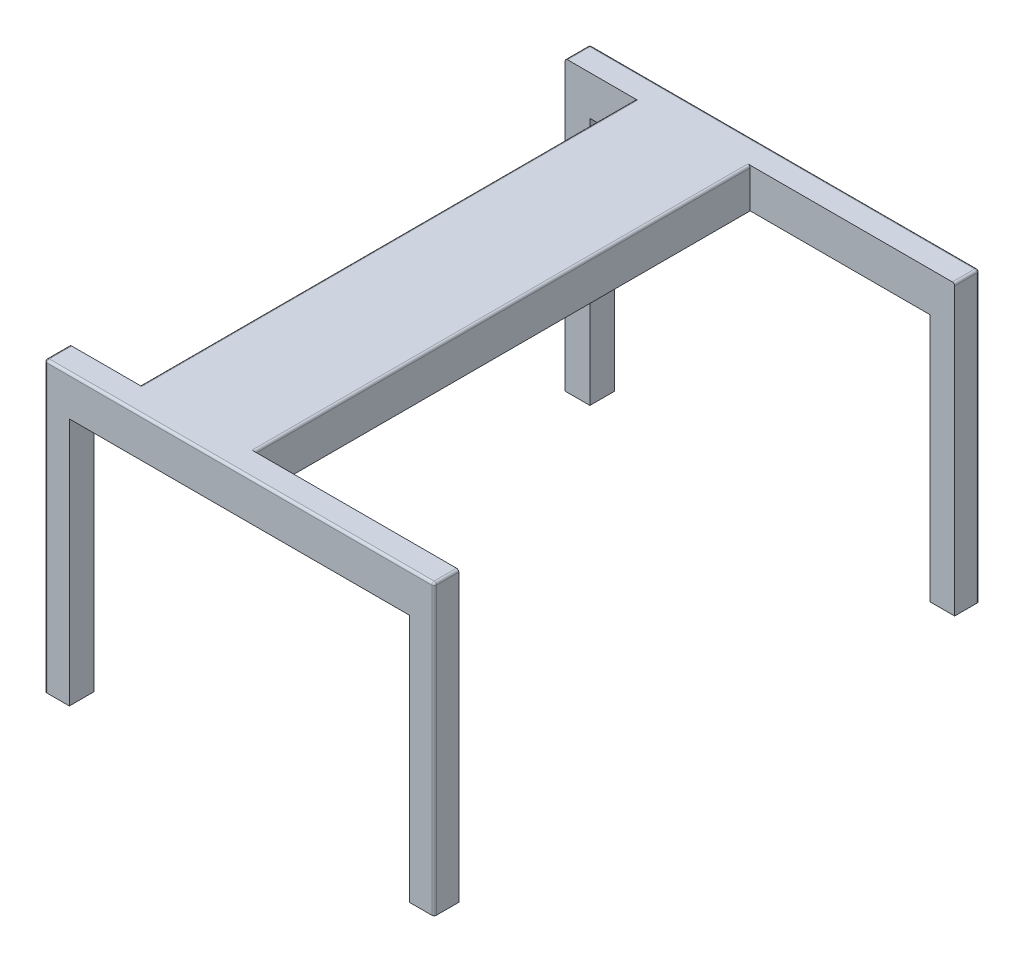
ISO-10303-21;
HEADER;
FILE_DESCRIPTION(('STEP AP214'),'2;1');
FILE_NAME('part.step','',(''),(''),'','','');
FILE_SCHEMA(('AUTOMOTIVE_DESIGN { 1 0 10303 214 1 1 1 1 }'));
ENDSEC;
DATA;
#1=APPLICATION_CONTEXT('core data for automotive mechanical design processes');
#2=APPLICATION_PROTOCOL_DEFINITION('international standard','automotive_design',2000,#1);
#3=PRODUCT_CONTEXT('',#1,'mechanical');
#4=PRODUCT('Part','Part','',(#3));
#5=PRODUCT_RELATED_PRODUCT_CATEGORY('part','',(#4));
#6=PRODUCT_DEFINITION_FORMATION('','',#4);
#7=PRODUCT_DEFINITION_CONTEXT('part definition',#1,'design');
#8=PRODUCT_DEFINITION('design','',#6,#7);
#9=PRODUCT_DEFINITION_SHAPE('','',#8);
#10=(LENGTH_UNIT() NAMED_UNIT(*) SI_UNIT(.MILLI.,.METRE.));
#11=(NAMED_UNIT(*) PLANE_ANGLE_UNIT() SI_UNIT($,.RADIAN.));
#12=(NAMED_UNIT(*) SI_UNIT($,.STERADIAN.) SOLID_ANGLE_UNIT());
#13=UNCERTAINTY_MEASURE_WITH_UNIT(LENGTH_MEASURE(1.E-05),#10,'distance_accuracy_value','');
#14=(GEOMETRIC_REPRESENTATION_CONTEXT(3) GLOBAL_UNCERTAINTY_ASSIGNED_CONTEXT((#13)) GLOBAL_UNIT_ASSIGNED_CONTEXT((#10,
#11,#12)) REPRESENTATION_CONTEXT('',''));
#15=CARTESIAN_POINT('',(0.,0.,0.));
#16=DIRECTION('',(0.,0.,1.));
#17=DIRECTION('',(1.,0.,0.));
#18=AXIS2_PLACEMENT_3D('',#15,#16,#17);
#19=CARTESIAN_POINT('',(1000.,0.,1400.));
#20=DIRECTION('',(-1.,0.,0.));
#21=DIRECTION('',(0.,0.,1.));
#22=AXIS2_PLACEMENT_3D('',#19,#20,#21);
#23=PLANE('',#22);
#24=DIRECTION('',(0.,0.,-1.));
#25=VECTOR('',#24,1.);
#26=CARTESIAN_POINT('',(1000.,-6.,1400.));
#27=LINE('',#26,#25);
#28=CARTESIAN_POINT('',(1000.,-6.00000000000001,1336.5));
#29=VERTEX_POINT('',#28);
#30=CARTESIAN_POINT('',(1000.,-6.,1394.));
#31=VERTEX_POINT('',#30);
#32=EDGE_CURVE('E326',#29,#31,#27,.F.);
#33=ORIENTED_EDGE('',*,*,#32,.T.);
#34=DIRECTION('',(0.,1.,0.));
#35=VECTOR('',#34,1.);
#36=CARTESIAN_POINT('',(1000.,-740.,1394.));
#37=LINE('',#36,#35);
#38=CARTESIAN_POINT('',(1000.,-740.,1394.));
#39=VERTEX_POINT('',#38);
#40=EDGE_CURVE('E377',#31,#39,#37,.F.);
#41=ORIENTED_EDGE('',*,*,#40,.T.);
#42=DIRECTION('',(0.,0.,-1.));
#43=VECTOR('',#42,1.);
#44=CARTESIAN_POINT('',(1000.,-740.,1400.));
#45=LINE('',#44,#43);
#46=CARTESIAN_POINT('',(1000.,-740.,1336.5));
#47=VERTEX_POINT('',#46);
#48=EDGE_CURVE('E285',#39,#47,#45,.T.);
#49=ORIENTED_EDGE('',*,*,#48,.T.);
#50=DIRECTION('',(0.,-1.,0.));
#51=VECTOR('',#50,1.);
#52=CARTESIAN_POINT('',(1000.,-101.6,1336.5));
#53=LINE('',#52,#51);
#54=EDGE_CURVE('E563',#29,#47,#53,.T.);
#55=ORIENTED_EDGE('',*,*,#54,.F.);
#56=EDGE_LOOP('',(#33,#41,#49,#55));
#57=FACE_BOUND('',#56,.T.);
#58=ADVANCED_FACE('F36',(#57),#23,.F.);
#59=CARTESIAN_POINT('',(0.,0.,1400.));
#60=DIRECTION('',(1.,0.,0.));
#61=DIRECTION('',(0.,1.,0.));
#62=AXIS2_PLACEMENT_3D('',#59,#60,#61);
#63=PLANE('',#62);
#64=DIRECTION('',(0.,0.,-1.));
#65=VECTOR('',#64,1.);
#66=CARTESIAN_POINT('',(0.,-6.,1400.));
#67=LINE('',#66,#65);
#68=CARTESIAN_POINT('',(0.,-6.00000000000001,63.5));
#69=VERTEX_POINT('',#68);
#70=CARTESIAN_POINT('',(0.,-6.,6.00000000000001));
#71=VERTEX_POINT('',#70);
#72=EDGE_CURVE('E315',#69,#71,#67,.T.);
#73=ORIENTED_EDGE('',*,*,#72,.T.);
#74=DIRECTION('',(0.,-1.,0.));
#75=VECTOR('',#74,1.);
#76=CARTESIAN_POINT('',(0.,0.,6.00000000000001));
#77=LINE('',#76,#75);
#78=CARTESIAN_POINT('',(0.,-740.,6.00000000000001));
#79=VERTEX_POINT('',#78);
#80=EDGE_CURVE('E364',#71,#79,#77,.T.);
#81=ORIENTED_EDGE('',*,*,#80,.T.);
#82=DIRECTION('',(0.,0.,-1.));
#83=VECTOR('',#82,1.);
#84=CARTESIAN_POINT('',(0.,-740.,1400.));
#85=LINE('',#84,#83);
#86=CARTESIAN_POINT('',(2.22044604925031E-13,-740.,63.4999999999999));
#87=VERTEX_POINT('',#86);
#88=EDGE_CURVE('E287',#87,#79,#85,.T.);
#89=ORIENTED_EDGE('',*,*,#88,.F.);
#90=DIRECTION('',(0.,1.,0.));
#91=VECTOR('',#90,1.);
#92=CARTESIAN_POINT('',(0.,-101.6,63.5));
#93=LINE('',#92,#91);
#94=EDGE_CURVE('E536',#87,#69,#93,.T.);
#95=ORIENTED_EDGE('',*,*,#94,.T.);
#96=EDGE_LOOP('',(#73,#81,#89,#95));
#97=FACE_BOUND('',#96,.T.);
#98=ADVANCED_FACE('F475',(#97),#63,.F.);
#99=CARTESIAN_POINT('',(0.,-740.,1400.));
#100=DIRECTION('',(0.,1.,0.));
#101=DIRECTION('',(0.,0.,1.));
#102=AXIS2_PLACEMENT_3D('',#99,#100,#101);
#103=PLANE('',#102);
#104=DIRECTION('',(1.,0.,0.));
#105=VECTOR('',#104,1.);
#106=CARTESIAN_POINT('',(0.,-740.,1400.));
#107=LINE('',#106,#105);
#108=CARTESIAN_POINT('',(6.00000000000009,-740.,1400.));
#109=VERTEX_POINT('',#108);
#110=CARTESIAN_POINT('',(63.5,-740.,1400.));
#111=VERTEX_POINT('',#110);
#112=EDGE_CURVE('E278',#109,#111,#107,.T.);
#113=ORIENTED_EDGE('',*,*,#112,.F.);
#114=CARTESIAN_POINT('',(6.00000000000009,-740.,1394.));
#115=DIRECTION('',(0.,1.,0.));
#116=DIRECTION('',(0.,0.,1.));
#117=AXIS2_PLACEMENT_3D('',#114,#115,#116);
#118=CIRCLE('',#117,6.);
#119=CARTESIAN_POINT('',(0.,-740.,1394.));
#120=VERTEX_POINT('',#119);
#121=EDGE_CURVE('E383',#109,#120,#118,.F.);
#122=ORIENTED_EDGE('',*,*,#121,.T.);
#123=CARTESIAN_POINT('',(2.22044604925031E-13,-740.,1336.5));
#124=VERTEX_POINT('',#123);
#125=EDGE_CURVE('E246',#120,#124,#85,.T.);
#126=ORIENTED_EDGE('',*,*,#125,.T.);
#127=DIRECTION('',(1.,0.,0.));
#128=VECTOR('',#127,1.);
#129=CARTESIAN_POINT('',(2.22044604925031E-13,-740.,1336.5));
#130=LINE('',#129,#128);
#131=CARTESIAN_POINT('',(63.5,-740.,1336.5));
#132=VERTEX_POINT('',#131);
#133=EDGE_CURVE('E429',#124,#132,#130,.T.);
#134=ORIENTED_EDGE('',*,*,#133,.T.);
#135=DIRECTION('',(0.,0.,1.));
#136=VECTOR('',#135,1.);
#137=CARTESIAN_POINT('',(63.5,-740.,-1081.51909830571));
#138=LINE('',#137,#136);
#139=EDGE_CURVE('E277',#132,#111,#138,.T.);
#140=ORIENTED_EDGE('',*,*,#139,.T.);
#141=EDGE_LOOP('',(#113,#122,#126,#134,#140));
#142=FACE_BOUND('',#141,.T.);
#143=ADVANCED_FACE('F424',(#142),#103,.F.);
#144=ORIENTED_EDGE('',*,*,#48,.F.);
#145=CARTESIAN_POINT('',(994.,-740.,1394.));
#146=DIRECTION('',(0.,1.,0.));
#147=DIRECTION('',(0.,0.,1.));
#148=AXIS2_PLACEMENT_3D('',#145,#146,#147);
#149=CIRCLE('',#148,6.);
#150=CARTESIAN_POINT('',(994.,-740.,1400.));
#151=VERTEX_POINT('',#150);
#152=EDGE_CURVE('E379',#39,#151,#149,.F.);
#153=ORIENTED_EDGE('',*,*,#152,.T.);
#154=CARTESIAN_POINT('',(936.5,-740.,1400.));
#155=VERTEX_POINT('',#154);
#156=EDGE_CURVE('E281',#155,#151,#107,.T.);
#157=ORIENTED_EDGE('',*,*,#156,.F.);
#158=DIRECTION('',(0.,0.,1.));
#159=VECTOR('',#158,1.);
#160=CARTESIAN_POINT('',(936.5,-740.,-1081.51909830571));
#161=LINE('',#160,#159);
#162=CARTESIAN_POINT('',(936.5,-740.,1336.5));
#163=VERTEX_POINT('',#162);
#164=EDGE_CURVE('E273',#163,#155,#161,.T.);
#165=ORIENTED_EDGE('',*,*,#164,.F.);
#166=EDGE_CURVE('E558',#163,#47,#130,.T.);
#167=ORIENTED_EDGE('',*,*,#166,.T.);
#168=EDGE_LOOP('',(#144,#153,#157,#165,#167));
#169=FACE_BOUND('',#168,.T.);
#170=ADVANCED_FACE('F455',(#169),#103,.F.);
#171=CARTESIAN_POINT('',(63.5,-740.,-1081.51909830571));
#172=DIRECTION('',(-1.,0.,0.));
#173=DIRECTION('',(0.,0.,1.));
#174=AXIS2_PLACEMENT_3D('',#171,#172,#173);
#175=PLANE('',#174);
#176=ORIENTED_EDGE('',*,*,#139,.F.);
#177=DIRECTION('',(0.,1.,0.));
#178=VECTOR('',#177,1.);
#179=CARTESIAN_POINT('',(63.5,-740.,1336.5));
#180=LINE('',#179,#178);
#181=CARTESIAN_POINT('',(63.5,-101.6,1336.5));
#182=VERTEX_POINT('',#181);
#183=EDGE_CURVE('E438',#132,#182,#180,.T.);
#184=ORIENTED_EDGE('',*,*,#183,.T.);
#185=DIRECTION('',(0.,0.,1.));
#186=VECTOR('',#185,1.);
#187=CARTESIAN_POINT('',(63.5,-101.6,-1081.51909830571));
#188=LINE('',#187,#186);
#189=CARTESIAN_POINT('',(63.5,-101.6,1400.));
#190=VERTEX_POINT('',#189);
#191=EDGE_CURVE('E265',#182,#190,#188,.T.);
#192=ORIENTED_EDGE('',*,*,#191,.T.);
#193=DIRECTION('',(0.,-1.,0.));
#194=VECTOR('',#193,1.);
#195=CARTESIAN_POINT('',(63.5,-740.,1400.));
#196=LINE('',#195,#194);
#197=EDGE_CURVE('E432',#190,#111,#196,.T.);
#198=ORIENTED_EDGE('',*,*,#197,.T.);
#199=EDGE_LOOP('',(#176,#184,#192,#198));
#200=FACE_BOUND('',#199,.T.);
#201=ADVANCED_FACE('F433',(#200),#175,.F.);
#202=CARTESIAN_POINT('',(936.5,-740.,-1081.51909830571));
#203=DIRECTION('',(1.,0.,0.));
#204=DIRECTION('',(0.,0.,-1.));
#205=AXIS2_PLACEMENT_3D('',#202,#203,#204);
#206=PLANE('',#205);
#207=DIRECTION('',(0.,0.,1.));
#208=VECTOR('',#207,1.);
#209=CARTESIAN_POINT('',(936.5,-101.6,-1081.51909830571));
#210=LINE('',#209,#208);
#211=CARTESIAN_POINT('',(936.5,-101.6,1336.5));
#212=VERTEX_POINT('',#211);
#213=CARTESIAN_POINT('',(936.5,-101.6,1400.));
#214=VERTEX_POINT('',#213);
#215=EDGE_CURVE('E266',#212,#214,#210,.T.);
#216=ORIENTED_EDGE('',*,*,#215,.F.);
#217=DIRECTION('',(0.,-1.,0.));
#218=VECTOR('',#217,1.);
#219=CARTESIAN_POINT('',(936.5,-740.,1336.5));
#220=LINE('',#219,#218);
#221=EDGE_CURVE('E245',#212,#163,#220,.T.);
#222=ORIENTED_EDGE('',*,*,#221,.T.);
#223=ORIENTED_EDGE('',*,*,#164,.T.);
#224=DIRECTION('',(0.,1.,0.));
#225=VECTOR('',#224,1.);
#226=CARTESIAN_POINT('',(936.5,-740.,1400.));
#227=LINE('',#226,#225);
#228=EDGE_CURVE('E437',#155,#214,#227,.T.);
#229=ORIENTED_EDGE('',*,*,#228,.T.);
#230=EDGE_LOOP('',(#216,#222,#223,#229));
#231=FACE_BOUND('',#230,.T.);
#232=ADVANCED_FACE('F597',(#231),#206,.F.);
#233=ORIENTED_EDGE('',*,*,#88,.T.);
#234=CARTESIAN_POINT('',(6.00000000000009,-740.,6.00000000000001));
#235=DIRECTION('',(0.,1.,0.));
#236=DIRECTION('',(0.,0.,1.));
#237=AXIS2_PLACEMENT_3D('',#234,#235,#236);
#238=CIRCLE('',#237,6.);
#239=CARTESIAN_POINT('',(6.00000000000009,-740.,0.));
#240=VERTEX_POINT('',#239);
#241=EDGE_CURVE('E366',#79,#240,#238,.F.);
#242=ORIENTED_EDGE('',*,*,#241,.T.);
#243=DIRECTION('',(1.,0.,0.));
#244=VECTOR('',#243,1.);
#245=CARTESIAN_POINT('',(0.,-740.,0.));
#246=LINE('',#245,#244);
#247=CARTESIAN_POINT('',(63.5,-740.,0.));
#248=VERTEX_POINT('',#247);
#249=EDGE_CURVE('E282',#240,#248,#246,.T.);
#250=ORIENTED_EDGE('',*,*,#249,.T.);
#251=CARTESIAN_POINT('',(63.5,-740.,63.4999999999999));
#252=VERTEX_POINT('',#251);
#253=EDGE_CURVE('E274',#248,#252,#138,.T.);
#254=ORIENTED_EDGE('',*,*,#253,.T.);
#255=DIRECTION('',(1.,0.,0.));
#256=VECTOR('',#255,1.);
#257=CARTESIAN_POINT('',(2.22044604925031E-13,-740.,63.4999999999999));
#258=LINE('',#257,#256);
#259=EDGE_CURVE('E555',#87,#252,#258,.T.);
#260=ORIENTED_EDGE('',*,*,#259,.F.);
#261=EDGE_LOOP('',(#233,#242,#250,#254,#260));
#262=FACE_BOUND('',#261,.T.);
#263=ADVANCED_FACE('F497',(#262),#103,.F.);
#264=ORIENTED_EDGE('',*,*,#125,.F.);
#265=DIRECTION('',(0.,-1.,0.));
#266=VECTOR('',#265,1.);
#267=CARTESIAN_POINT('',(0.,-6.,1394.));
#268=LINE('',#267,#266);
#269=CARTESIAN_POINT('',(0.,-6.,1394.));
#270=VERTEX_POINT('',#269);
#271=EDGE_CURVE('E61',#120,#270,#268,.F.);
#272=ORIENTED_EDGE('',*,*,#271,.T.);
#273=DIRECTION('',(0.,0.,-1.));
#274=VECTOR('',#273,1.);
#275=CARTESIAN_POINT('',(0.,-6.,1400.));
#276=LINE('',#275,#274);
#277=CARTESIAN_POINT('',(0.,-6.00000000000001,1336.5));
#278=VERTEX_POINT('',#277);
#279=EDGE_CURVE('E302',#270,#278,#276,.T.);
#280=ORIENTED_EDGE('',*,*,#279,.T.);
#281=DIRECTION('',(0.,-1.,0.));
#282=VECTOR('',#281,1.);
#283=CARTESIAN_POINT('',(0.,-101.6,1336.5));
#284=LINE('',#283,#282);
#285=EDGE_CURVE('E562',#278,#124,#284,.T.);
#286=ORIENTED_EDGE('',*,*,#285,.T.);
#287=EDGE_LOOP('',(#264,#272,#280,#286));
#288=FACE_BOUND('',#287,.T.);
#289=ADVANCED_FACE('F484',(#288),#63,.F.);
#290=CARTESIAN_POINT('',(936.5,-740.,0.));
#291=VERTEX_POINT('',#290);
#292=CARTESIAN_POINT('',(994.,-740.,0.));
#293=VERTEX_POINT('',#292);
#294=EDGE_CURVE('E284',#291,#293,#246,.T.);
#295=ORIENTED_EDGE('',*,*,#294,.T.);
#296=CARTESIAN_POINT('',(994.,-740.,6.00000000000001));
#297=DIRECTION('',(0.,1.,0.));
#298=DIRECTION('',(0.,0.,1.));
#299=AXIS2_PLACEMENT_3D('',#296,#297,#298);
#300=CIRCLE('',#299,6.);
#301=CARTESIAN_POINT('',(1000.,-740.,6.00000000000001));
#302=VERTEX_POINT('',#301);
#303=EDGE_CURVE('E360',#293,#302,#300,.F.);
#304=ORIENTED_EDGE('',*,*,#303,.T.);
#305=CARTESIAN_POINT('',(1000.,-740.,63.4999999999999));
#306=VERTEX_POINT('',#305);
#307=EDGE_CURVE('E280',#306,#302,#45,.T.);
#308=ORIENTED_EDGE('',*,*,#307,.F.);
#309=CARTESIAN_POINT('',(936.5,-740.,63.4999999999999));
#310=VERTEX_POINT('',#309);
#311=EDGE_CURVE('E557',#310,#306,#258,.T.);
#312=ORIENTED_EDGE('',*,*,#311,.F.);
#313=EDGE_CURVE('E242',#291,#310,#161,.T.);
#314=ORIENTED_EDGE('',*,*,#313,.F.);
#315=EDGE_LOOP('',(#295,#304,#308,#312,#314));
#316=FACE_BOUND('',#315,.T.);
#317=ADVANCED_FACE('F489',(#316),#103,.F.);
#318=ORIENTED_EDGE('',*,*,#307,.T.);
#319=DIRECTION('',(0.,1.,0.));
#320=VECTOR('',#319,1.);
#321=CARTESIAN_POINT('',(1000.,0.,6.00000000000001));
#322=LINE('',#321,#320);
#323=CARTESIAN_POINT('',(1000.,-6.,6.00000000000001));
#324=VERTEX_POINT('',#323);
#325=EDGE_CURVE('E351',#302,#324,#322,.T.);
#326=ORIENTED_EDGE('',*,*,#325,.T.);
#327=DIRECTION('',(0.,0.,-1.));
#328=VECTOR('',#327,1.);
#329=CARTESIAN_POINT('',(1000.,-6.,1400.));
#330=LINE('',#329,#328);
#331=CARTESIAN_POINT('',(1000.,-6.00000000000001,63.5));
#332=VERTEX_POINT('',#331);
#333=EDGE_CURVE('E320',#324,#332,#330,.F.);
#334=ORIENTED_EDGE('',*,*,#333,.T.);
#335=DIRECTION('',(0.,1.,0.));
#336=VECTOR('',#335,1.);
#337=CARTESIAN_POINT('',(1000.,-101.6,63.5));
#338=LINE('',#337,#336);
#339=EDGE_CURVE('E503',#306,#332,#338,.T.);
#340=ORIENTED_EDGE('',*,*,#339,.F.);
#341=EDGE_LOOP('',(#318,#326,#334,#340));
#342=FACE_BOUND('',#341,.T.);
#343=ADVANCED_FACE('F478',(#342),#23,.F.);
#344=CARTESIAN_POINT('',(0.,0.,1400.));
#345=DIRECTION('',(0.,-1.,0.));
#346=DIRECTION('',(0.,0.,-1.));
#347=AXIS2_PLACEMENT_3D('',#344,#345,#346);
#348=PLANE('',#347);
#349=DIRECTION('',(0.,0.,-1.));
#350=VECTOR('',#349,1.);
#351=CARTESIAN_POINT('',(994.,0.,1400.));
#352=LINE('',#351,#350);
#353=CARTESIAN_POINT('',(994.,0.,63.5));
#354=VERTEX_POINT('',#353);
#355=CARTESIAN_POINT('',(994.,0.,6.00000000000001));
#356=VERTEX_POINT('',#355);
#357=EDGE_CURVE('E308',#354,#356,#352,.T.);
#358=ORIENTED_EDGE('',*,*,#357,.T.);
#359=DIRECTION('',(-1.,0.,0.));
#360=VECTOR('',#359,1.);
#361=CARTESIAN_POINT('',(0.,0.,6.00000000000001));
#362=LINE('',#361,#360);
#363=CARTESIAN_POINT('',(6.,0.,6.00000000000001));
#364=VERTEX_POINT('',#363);
#365=EDGE_CURVE('E11',#356,#364,#362,.T.);
#366=ORIENTED_EDGE('',*,*,#365,.T.);
#367=DIRECTION('',(0.,0.,-1.));
#368=VECTOR('',#367,1.);
#369=CARTESIAN_POINT('',(6.,0.,1400.));
#370=LINE('',#369,#368);
#371=CARTESIAN_POINT('',(6.,0.,63.5));
#372=VERTEX_POINT('',#371);
#373=EDGE_CURVE('E311',#364,#372,#370,.F.);
#374=ORIENTED_EDGE('',*,*,#373,.T.);
#375=DIRECTION('',(-1.,0.,0.));
#376=VECTOR('',#375,1.);
#377=CARTESIAN_POINT('',(0.,0.,63.5));
#378=LINE('',#377,#376);
#379=CARTESIAN_POINT('',(186.,0.,63.5));
#380=VERTEX_POINT('',#379);
#381=EDGE_CURVE('E573',#380,#372,#378,.T.);
#382=ORIENTED_EDGE('',*,*,#381,.F.);
#383=DIRECTION('',(0.,0.,-1.));
#384=VECTOR('',#383,1.);
#385=CARTESIAN_POINT('',(186.,0.,1400.));
#386=LINE('',#385,#384);
#387=CARTESIAN_POINT('',(186.,0.,1336.5));
#388=VERTEX_POINT('',#387);
#389=EDGE_CURVE('E335',#380,#388,#386,.F.);
#390=ORIENTED_EDGE('',*,*,#389,.T.);
#391=DIRECTION('',(1.,0.,0.));
#392=VECTOR('',#391,1.);
#393=CARTESIAN_POINT('',(1.55897537531458E-13,0.,1336.5));
#394=LINE('',#393,#392);
#395=CARTESIAN_POINT('',(6.,0.,1336.5));
#396=VERTEX_POINT('',#395);
#397=EDGE_CURVE('E257',#396,#388,#394,.T.);
#398=ORIENTED_EDGE('',*,*,#397,.F.);
#399=DIRECTION('',(0.,0.,-1.));
#400=VECTOR('',#399,1.);
#401=CARTESIAN_POINT('',(6.,0.,1400.));
#402=LINE('',#401,#400);
#403=CARTESIAN_POINT('',(6.,0.,1394.));
#404=VERTEX_POINT('',#403);
#405=EDGE_CURVE('E313',#396,#404,#402,.F.);
#406=ORIENTED_EDGE('',*,*,#405,.T.);
#407=DIRECTION('',(-1.,0.,0.));
#408=VECTOR('',#407,1.);
#409=CARTESIAN_POINT('',(994.,0.,1394.));
#410=LINE('',#409,#408);
#411=CARTESIAN_POINT('',(994.,0.,1394.));
#412=VERTEX_POINT('',#411);
#413=EDGE_CURVE('E45',#404,#412,#410,.F.);
#414=ORIENTED_EDGE('',*,*,#413,.T.);
#415=DIRECTION('',(0.,0.,-1.));
#416=VECTOR('',#415,1.);
#417=CARTESIAN_POINT('',(994.,0.,1400.));
#418=LINE('',#417,#416);
#419=CARTESIAN_POINT('',(994.,0.,1336.5));
#420=VERTEX_POINT('',#419);
#421=EDGE_CURVE('E306',#412,#420,#418,.T.);
#422=ORIENTED_EDGE('',*,*,#421,.T.);
#423=DIRECTION('',(1.,0.,0.));
#424=VECTOR('',#423,1.);
#425=CARTESIAN_POINT('',(1000.,0.,1336.5));
#426=LINE('',#425,#424);
#427=CARTESIAN_POINT('',(469.,0.,1336.5));
#428=VERTEX_POINT('',#427);
#429=EDGE_CURVE('E580',#428,#420,#426,.T.);
#430=ORIENTED_EDGE('',*,*,#429,.F.);
#431=DIRECTION('',(0.,0.,1.));
#432=VECTOR('',#431,1.);
#433=CARTESIAN_POINT('',(469.,0.,1400.));
#434=LINE('',#433,#432);
#435=CARTESIAN_POINT('',(469.,0.,63.5000000000001));
#436=VERTEX_POINT('',#435);
#437=EDGE_CURVE('E332',#428,#436,#434,.F.);
#438=ORIENTED_EDGE('',*,*,#437,.T.);
#439=DIRECTION('',(-1.,0.,0.));
#440=VECTOR('',#439,1.);
#441=CARTESIAN_POINT('',(1000.,0.,63.5));
#442=LINE('',#441,#440);
#443=EDGE_CURVE('E399',#354,#436,#442,.T.);
#444=ORIENTED_EDGE('',*,*,#443,.F.);
#445=EDGE_LOOP('',(#358,#366,#374,#382,#390,#398,#406,#414,#422,#430,#438,#444));
#446=FACE_BOUND('',#445,.T.);
#447=ADVANCED_FACE('F488',(#446),#348,.F.);
#448=CARTESIAN_POINT('',(0.,0.,1400.));
#449=DIRECTION('',(0.,0.,1.));
#450=DIRECTION('',(1.,0.,0.));
#451=AXIS2_PLACEMENT_3D('',#448,#449,#450);
#452=PLANE('',#451);
#453=ORIENTED_EDGE('',*,*,#156,.T.);
#454=DIRECTION('',(0.,1.,0.));
#455=VECTOR('',#454,1.);
#456=CARTESIAN_POINT('',(994.,-6.,1400.));
#457=LINE('',#456,#455);
#458=CARTESIAN_POINT('',(994.,-6.,1400.));
#459=VERTEX_POINT('',#458);
#460=EDGE_CURVE('E374',#151,#459,#457,.T.);
#461=ORIENTED_EDGE('',*,*,#460,.T.);
#462=DIRECTION('',(-1.,0.,0.));
#463=VECTOR('',#462,1.);
#464=CARTESIAN_POINT('',(6.,-6.,1400.));
#465=LINE('',#464,#463);
#466=CARTESIAN_POINT('',(6.,-6.,1400.));
#467=VERTEX_POINT('',#466);
#468=EDGE_CURVE('E370',#459,#467,#465,.T.);
#469=ORIENTED_EDGE('',*,*,#468,.T.);
#470=DIRECTION('',(0.,-1.,0.));
#471=VECTOR('',#470,1.);
#472=CARTESIAN_POINT('',(6.00000000000009,-740.,1400.));
#473=LINE('',#472,#471);
#474=EDGE_CURVE('E372',#467,#109,#473,.T.);
#475=ORIENTED_EDGE('',*,*,#474,.T.);
#476=ORIENTED_EDGE('',*,*,#112,.T.);
#477=ORIENTED_EDGE('',*,*,#197,.F.);
#478=DIRECTION('',(-1.,0.,0.));
#479=VECTOR('',#478,1.);
#480=CARTESIAN_POINT('',(63.5,-101.6,1400.));
#481=LINE('',#480,#479);
#482=EDGE_CURVE('E431',#214,#190,#481,.T.);
#483=ORIENTED_EDGE('',*,*,#482,.F.);
#484=ORIENTED_EDGE('',*,*,#228,.F.);
#485=EDGE_LOOP('',(#453,#461,#469,#475,#476,#477,#483,#484));
#486=FACE_BOUND('',#485,.T.);
#487=ADVANCED_FACE('F420',(#486),#452,.T.);
#488=CARTESIAN_POINT('',(0.,0.,0.));
#489=DIRECTION('',(0.,0.,1.));
#490=DIRECTION('',(1.,0.,0.));
#491=AXIS2_PLACEMENT_3D('',#488,#489,#490);
#492=PLANE('',#491);
#493=DIRECTION('',(-1.,0.,0.));
#494=VECTOR('',#493,1.);
#495=CARTESIAN_POINT('',(0.,-6.,0.));
#496=LINE('',#495,#494);
#497=CARTESIAN_POINT('',(6.,-6.,0.));
#498=VERTEX_POINT('',#497);
#499=CARTESIAN_POINT('',(994.,-6.,0.));
#500=VERTEX_POINT('',#499);
#501=EDGE_CURVE('E354',#498,#500,#496,.F.);
#502=ORIENTED_EDGE('',*,*,#501,.T.);
#503=DIRECTION('',(0.,1.,0.));
#504=VECTOR('',#503,1.);
#505=CARTESIAN_POINT('',(994.,0.,0.));
#506=LINE('',#505,#504);
#507=EDGE_CURVE('E358',#500,#293,#506,.F.);
#508=ORIENTED_EDGE('',*,*,#507,.T.);
#509=ORIENTED_EDGE('',*,*,#294,.F.);
#510=DIRECTION('',(0.,-1.,0.));
#511=VECTOR('',#510,1.);
#512=CARTESIAN_POINT('',(936.5,-740.,0.));
#513=LINE('',#512,#511);
#514=CARTESIAN_POINT('',(936.5,-101.6,0.));
#515=VERTEX_POINT('',#514);
#516=EDGE_CURVE('E551',#515,#291,#513,.T.);
#517=ORIENTED_EDGE('',*,*,#516,.F.);
#518=DIRECTION('',(1.,0.,0.));
#519=VECTOR('',#518,1.);
#520=CARTESIAN_POINT('',(63.5,-101.6,0.));
#521=LINE('',#520,#519);
#522=CARTESIAN_POINT('',(63.5,-101.6,0.));
#523=VERTEX_POINT('',#522);
#524=EDGE_CURVE('E263',#523,#515,#521,.T.);
#525=ORIENTED_EDGE('',*,*,#524,.F.);
#526=DIRECTION('',(0.,1.,0.));
#527=VECTOR('',#526,1.);
#528=CARTESIAN_POINT('',(63.5,-740.,0.));
#529=LINE('',#528,#527);
#530=EDGE_CURVE('E445',#248,#523,#529,.T.);
#531=ORIENTED_EDGE('',*,*,#530,.F.);
#532=ORIENTED_EDGE('',*,*,#249,.F.);
#533=DIRECTION('',(0.,-1.,0.));
#534=VECTOR('',#533,1.);
#535=CARTESIAN_POINT('',(6.,0.,0.));
#536=LINE('',#535,#534);
#537=EDGE_CURVE('E356',#240,#498,#536,.F.);
#538=ORIENTED_EDGE('',*,*,#537,.T.);
#539=EDGE_LOOP('',(#502,#508,#509,#517,#525,#531,#532,#538));
#540=FACE_BOUND('',#539,.T.);
#541=ADVANCED_FACE('F547',(#540),#492,.F.);
#542=CARTESIAN_POINT('',(63.5,-101.6,63.4999999999999));
#543=VERTEX_POINT('',#542);
#544=EDGE_CURVE('E268',#523,#543,#188,.T.);
#545=ORIENTED_EDGE('',*,*,#544,.T.);
#546=DIRECTION('',(0.,-1.,0.));
#547=VECTOR('',#546,1.);
#548=CARTESIAN_POINT('',(63.5,-740.,63.4999999999999));
#549=LINE('',#548,#547);
#550=EDGE_CURVE('E442',#543,#252,#549,.T.);
#551=ORIENTED_EDGE('',*,*,#550,.T.);
#552=ORIENTED_EDGE('',*,*,#253,.F.);
#553=ORIENTED_EDGE('',*,*,#530,.T.);
#554=EDGE_LOOP('',(#545,#551,#552,#553));
#555=FACE_BOUND('',#554,.T.);
#556=ADVANCED_FACE('F605',(#555),#175,.F.);
#557=CARTESIAN_POINT('',(63.5,-101.6,-1081.51909830571));
#558=DIRECTION('',(0.,1.,0.));
#559=DIRECTION('',(-1.,0.,0.));
#560=AXIS2_PLACEMENT_3D('',#557,#558,#559);
#561=PLANE('',#560);
#562=DIRECTION('',(0.,0.,1.));
#563=VECTOR('',#562,1.);
#564=CARTESIAN_POINT('',(475.,-101.6,-1081.51909830571));
#565=LINE('',#564,#563);
#566=CARTESIAN_POINT('',(475.,-101.6,63.5000000000001));
#567=VERTEX_POINT('',#566);
#568=CARTESIAN_POINT('',(475.,-101.6,1336.5));
#569=VERTEX_POINT('',#568);
#570=EDGE_CURVE('E298',#567,#569,#565,.T.);
#571=ORIENTED_EDGE('',*,*,#570,.T.);
#572=DIRECTION('',(1.,0.,0.));
#573=VECTOR('',#572,1.);
#574=CARTESIAN_POINT('',(63.5,-101.6,1336.5));
#575=LINE('',#574,#573);
#576=EDGE_CURVE('E300',#569,#212,#575,.T.);
#577=ORIENTED_EDGE('',*,*,#576,.T.);
#578=ORIENTED_EDGE('',*,*,#215,.T.);
#579=ORIENTED_EDGE('',*,*,#482,.T.);
#580=ORIENTED_EDGE('',*,*,#191,.F.);
#581=DIRECTION('',(1.,0.,0.));
#582=VECTOR('',#581,1.);
#583=CARTESIAN_POINT('',(63.5,-101.6,1336.5));
#584=LINE('',#583,#582);
#585=CARTESIAN_POINT('',(180.,-101.6,1336.5));
#586=VERTEX_POINT('',#585);
#587=EDGE_CURVE('E290',#182,#586,#584,.T.);
#588=ORIENTED_EDGE('',*,*,#587,.T.);
#589=DIRECTION('',(0.,0.,-1.));
#590=VECTOR('',#589,1.);
#591=CARTESIAN_POINT('',(180.,-101.6,-1081.51909830571));
#592=LINE('',#591,#590);
#593=CARTESIAN_POINT('',(180.,-101.6,63.5));
#594=VERTEX_POINT('',#593);
#595=EDGE_CURVE('E293',#586,#594,#592,.T.);
#596=ORIENTED_EDGE('',*,*,#595,.T.);
#597=DIRECTION('',(-1.,0.,0.));
#598=VECTOR('',#597,1.);
#599=CARTESIAN_POINT('',(63.5,-101.6,63.4999999999999));
#600=LINE('',#599,#598);
#601=EDGE_CURVE('E296',#594,#543,#600,.T.);
#602=ORIENTED_EDGE('',*,*,#601,.T.);
#603=ORIENTED_EDGE('',*,*,#544,.F.);
#604=ORIENTED_EDGE('',*,*,#524,.T.);
#605=CARTESIAN_POINT('',(936.5,-101.6,63.4999999999999));
#606=VERTEX_POINT('',#605);
#607=EDGE_CURVE('E239',#515,#606,#210,.T.);
#608=ORIENTED_EDGE('',*,*,#607,.T.);
#609=DIRECTION('',(-1.,0.,0.));
#610=VECTOR('',#609,1.);
#611=CARTESIAN_POINT('',(63.5000000000002,-101.6,63.5000000000001));
#612=LINE('',#611,#610);
#613=EDGE_CURVE('E249',#606,#567,#612,.T.);
#614=ORIENTED_EDGE('',*,*,#613,.T.);
#615=EDGE_LOOP('',(#571,#577,#578,#579,#580,#588,#596,#602,#603,#604,#608,#614));
#616=FACE_BOUND('',#615,.T.);
#617=ADVANCED_FACE('F260',(#616),#561,.F.);
#618=ORIENTED_EDGE('',*,*,#313,.T.);
#619=DIRECTION('',(0.,1.,0.));
#620=VECTOR('',#619,1.);
#621=CARTESIAN_POINT('',(936.5,-740.,63.4999999999999));
#622=LINE('',#621,#620);
#623=EDGE_CURVE('E235',#310,#606,#622,.T.);
#624=ORIENTED_EDGE('',*,*,#623,.T.);
#625=ORIENTED_EDGE('',*,*,#607,.F.);
#626=ORIENTED_EDGE('',*,*,#516,.T.);
#627=EDGE_LOOP('',(#618,#624,#625,#626));
#628=FACE_BOUND('',#627,.T.);
#629=ADVANCED_FACE('F237',(#628),#206,.F.);
#630=CARTESIAN_POINT('',(0.,-101.6,63.5));
#631=DIRECTION('',(0.,0.,-1.));
#632=DIRECTION('',(0.,1.,0.));
#633=AXIS2_PLACEMENT_3D('',#630,#631,#632);
#634=PLANE('',#633);
#635=ORIENTED_EDGE('',*,*,#339,.T.);
#636=CARTESIAN_POINT('',(994.,-6.,63.4999999999999));
#637=DIRECTION('',(0.,0.,-1.));
#638=DIRECTION('',(0.,1.,0.));
#639=AXIS2_PLACEMENT_3D('',#636,#637,#638);
#640=CIRCLE('',#639,6.);
#641=EDGE_CURVE('E322',#332,#354,#640,.F.);
#642=ORIENTED_EDGE('',*,*,#641,.T.);
#643=ORIENTED_EDGE('',*,*,#443,.T.);
#644=CARTESIAN_POINT('',(469.,-6.00000000000001,63.5));
#645=DIRECTION('',(0.,0.,-1.));
#646=DIRECTION('',(0.,1.,0.));
#647=AXIS2_PLACEMENT_3D('',#644,#645,#646);
#648=CIRCLE('',#647,6.);
#649=CARTESIAN_POINT('',(475.,-6.00000000000001,63.5000000000001));
#650=VERTEX_POINT('',#649);
#651=EDGE_CURVE('E349',#436,#650,#648,.T.);
#652=ORIENTED_EDGE('',*,*,#651,.T.);
#653=DIRECTION('',(0.,1.,0.));
#654=VECTOR('',#653,1.);
#655=CARTESIAN_POINT('',(475.,-200.,63.5000000000001));
#656=LINE('',#655,#654);
#657=EDGE_CURVE('E253',#567,#650,#656,.T.);
#658=ORIENTED_EDGE('',*,*,#657,.F.);
#659=ORIENTED_EDGE('',*,*,#613,.F.);
#660=ORIENTED_EDGE('',*,*,#623,.F.);
#661=ORIENTED_EDGE('',*,*,#311,.T.);
#662=EDGE_LOOP('',(#635,#642,#643,#652,#658,#659,#660,#661));
#663=FACE_BOUND('',#662,.T.);
#664=ADVANCED_FACE('F251',(#663),#634,.F.);
#665=CARTESIAN_POINT('',(0.,-101.6,1336.5));
#666=DIRECTION('',(0.,0.,1.));
#667=DIRECTION('',(1.,0.,0.));
#668=AXIS2_PLACEMENT_3D('',#665,#666,#667);
#669=PLANE('',#668);
#670=ORIENTED_EDGE('',*,*,#429,.T.);
#671=CARTESIAN_POINT('',(994.,-6.,1336.5));
#672=DIRECTION('',(0.,0.,1.));
#673=DIRECTION('',(1.,0.,0.));
#674=AXIS2_PLACEMENT_3D('',#671,#672,#673);
#675=CIRCLE('',#674,6.);
#676=EDGE_CURVE('E324',#420,#29,#675,.F.);
#677=ORIENTED_EDGE('',*,*,#676,.T.);
#678=ORIENTED_EDGE('',*,*,#54,.T.);
#679=ORIENTED_EDGE('',*,*,#166,.F.);
#680=ORIENTED_EDGE('',*,*,#221,.F.);
#681=ORIENTED_EDGE('',*,*,#576,.F.);
#682=DIRECTION('',(0.,1.,0.));
#683=VECTOR('',#682,1.);
#684=CARTESIAN_POINT('',(475.,-200.,1336.5));
#685=LINE('',#684,#683);
#686=CARTESIAN_POINT('',(475.,-6.00000000000001,1336.5));
#687=VERTEX_POINT('',#686);
#688=EDGE_CURVE('E258',#569,#687,#685,.T.);
#689=ORIENTED_EDGE('',*,*,#688,.T.);
#690=CARTESIAN_POINT('',(469.,-6.00000000000001,1336.5));
#691=DIRECTION('',(0.,0.,1.));
#692=DIRECTION('',(1.,0.,0.));
#693=AXIS2_PLACEMENT_3D('',#690,#691,#692);
#694=CIRCLE('',#693,6.);
#695=EDGE_CURVE('E346',#687,#428,#694,.T.);
#696=ORIENTED_EDGE('',*,*,#695,.T.);
#697=EDGE_LOOP('',(#670,#677,#678,#679,#680,#681,#689,#696));
#698=FACE_BOUND('',#697,.T.);
#699=ADVANCED_FACE('F594',(#698),#669,.F.);
#700=ORIENTED_EDGE('',*,*,#285,.F.);
#701=CARTESIAN_POINT('',(6.,-6.,1336.5));
#702=DIRECTION('',(0.,0.,1.));
#703=DIRECTION('',(1.,0.,0.));
#704=AXIS2_PLACEMENT_3D('',#701,#702,#703);
#705=CIRCLE('',#704,6.);
#706=EDGE_CURVE('E304',#278,#396,#705,.F.);
#707=ORIENTED_EDGE('',*,*,#706,.T.);
#708=ORIENTED_EDGE('',*,*,#397,.T.);
#709=CARTESIAN_POINT('',(186.,-6.00000000000001,1336.5));
#710=DIRECTION('',(0.,0.,1.));
#711=DIRECTION('',(1.,0.,0.));
#712=AXIS2_PLACEMENT_3D('',#709,#710,#711);
#713=CIRCLE('',#712,6.);
#714=CARTESIAN_POINT('',(180.,-6.00000000000001,1336.5));
#715=VERTEX_POINT('',#714);
#716=EDGE_CURVE('E344',#388,#715,#713,.T.);
#717=ORIENTED_EDGE('',*,*,#716,.T.);
#718=DIRECTION('',(0.,1.,0.));
#719=VECTOR('',#718,1.);
#720=CARTESIAN_POINT('',(180.,-200.,1336.5));
#721=LINE('',#720,#719);
#722=EDGE_CURVE('E570',#586,#715,#721,.T.);
#723=ORIENTED_EDGE('',*,*,#722,.F.);
#724=ORIENTED_EDGE('',*,*,#587,.F.);
#725=ORIENTED_EDGE('',*,*,#183,.F.);
#726=ORIENTED_EDGE('',*,*,#133,.F.);
#727=EDGE_LOOP('',(#700,#707,#708,#717,#723,#724,#725,#726));
#728=FACE_BOUND('',#727,.T.);
#729=ADVANCED_FACE('F618',(#728),#669,.F.);
#730=ORIENTED_EDGE('',*,*,#381,.T.);
#731=CARTESIAN_POINT('',(6.,-6.,63.4999999999999));
#732=DIRECTION('',(0.,0.,-1.));
#733=DIRECTION('',(0.,1.,0.));
#734=AXIS2_PLACEMENT_3D('',#731,#732,#733);
#735=CIRCLE('',#734,6.);
#736=EDGE_CURVE('E318',#372,#69,#735,.F.);
#737=ORIENTED_EDGE('',*,*,#736,.T.);
#738=ORIENTED_EDGE('',*,*,#94,.F.);
#739=ORIENTED_EDGE('',*,*,#259,.T.);
#740=ORIENTED_EDGE('',*,*,#550,.F.);
#741=ORIENTED_EDGE('',*,*,#601,.F.);
#742=DIRECTION('',(0.,1.,0.));
#743=VECTOR('',#742,1.);
#744=CARTESIAN_POINT('',(180.,-200.,63.5));
#745=LINE('',#744,#743);
#746=CARTESIAN_POINT('',(180.,-6.00000000000001,63.5));
#747=VERTEX_POINT('',#746);
#748=EDGE_CURVE('E566',#594,#747,#745,.T.);
#749=ORIENTED_EDGE('',*,*,#748,.T.);
#750=CARTESIAN_POINT('',(186.,-6.00000000000001,63.5));
#751=DIRECTION('',(0.,0.,-1.));
#752=DIRECTION('',(0.,1.,0.));
#753=AXIS2_PLACEMENT_3D('',#750,#751,#752);
#754=CIRCLE('',#753,6.);
#755=EDGE_CURVE('E341',#747,#380,#754,.T.);
#756=ORIENTED_EDGE('',*,*,#755,.T.);
#757=EDGE_LOOP('',(#730,#737,#738,#739,#740,#741,#749,#756));
#758=FACE_BOUND('',#757,.T.);
#759=ADVANCED_FACE('F613',(#758),#634,.F.);
#760=CARTESIAN_POINT('',(180.,-200.,63.5));
#761=DIRECTION('',(1.,0.,0.));
#762=DIRECTION('',(0.,0.,-1.));
#763=AXIS2_PLACEMENT_3D('',#760,#761,#762);
#764=PLANE('',#763);
#765=ORIENTED_EDGE('',*,*,#722,.T.);
#766=DIRECTION('',(0.,0.,-1.));
#767=VECTOR('',#766,1.);
#768=CARTESIAN_POINT('',(180.,-6.00000000000001,63.5));
#769=LINE('',#768,#767);
#770=EDGE_CURVE('E329',#715,#747,#769,.T.);
#771=ORIENTED_EDGE('',*,*,#770,.T.);
#772=ORIENTED_EDGE('',*,*,#748,.F.);
#773=ORIENTED_EDGE('',*,*,#595,.F.);
#774=EDGE_LOOP('',(#765,#771,#772,#773));
#775=FACE_BOUND('',#774,.T.);
#776=ADVANCED_FACE('F623',(#775),#764,.F.);
#777=CARTESIAN_POINT('',(475.,-200.,63.5000000000001));
#778=DIRECTION('',(-1.,0.,0.));
#779=DIRECTION('',(0.,0.,1.));
#780=AXIS2_PLACEMENT_3D('',#777,#778,#779);
#781=PLANE('',#780);
#782=ORIENTED_EDGE('',*,*,#657,.T.);
#783=DIRECTION('',(0.,0.,1.));
#784=VECTOR('',#783,1.);
#785=CARTESIAN_POINT('',(475.,-6.00000000000001,63.5000000000001));
#786=LINE('',#785,#784);
#787=EDGE_CURVE('E338',#650,#687,#786,.T.);
#788=ORIENTED_EDGE('',*,*,#787,.T.);
#789=ORIENTED_EDGE('',*,*,#688,.F.);
#790=ORIENTED_EDGE('',*,*,#570,.F.);
#791=EDGE_LOOP('',(#782,#788,#789,#790));
#792=FACE_BOUND('',#791,.T.);
#793=ADVANCED_FACE('F592',(#792),#781,.F.);
#794=CARTESIAN_POINT('',(6.,-6.,1400.));
#795=DIRECTION('',(0.,0.,-1.));
#796=DIRECTION('',(-1.,0.,0.));
#797=AXIS2_PLACEMENT_3D('',#794,#795,#796);
#798=CYLINDRICAL_SURFACE('',#797,6.);
#799=ORIENTED_EDGE('',*,*,#279,.F.);
#800=CARTESIAN_POINT('',(6.,-6.,1394.));
#801=DIRECTION('',(0.,0.,-1.));
#802=DIRECTION('',(-1.,0.,0.));
#803=AXIS2_PLACEMENT_3D('',#800,#801,#802);
#804=CIRCLE('',#803,6.);
#805=EDGE_CURVE('E53',#270,#404,#804,.T.);
#806=ORIENTED_EDGE('',*,*,#805,.T.);
#807=ORIENTED_EDGE('',*,*,#405,.F.);
#808=ORIENTED_EDGE('',*,*,#706,.F.);
#809=EDGE_LOOP('',(#799,#806,#807,#808));
#810=FACE_BOUND('',#809,.T.);
#811=ADVANCED_FACE('F629',(#810),#798,.T.);
#812=CARTESIAN_POINT('',(6.,-6.,1400.));
#813=DIRECTION('',(0.,0.,-1.));
#814=DIRECTION('',(-1.,0.,0.));
#815=AXIS2_PLACEMENT_3D('',#812,#813,#814);
#816=CYLINDRICAL_SURFACE('',#815,6.);
#817=ORIENTED_EDGE('',*,*,#373,.F.);
#818=CARTESIAN_POINT('',(6.,-6.,6.00000000000001));
#819=DIRECTION('',(0.,0.,-1.));
#820=DIRECTION('',(-1.,0.,0.));
#821=AXIS2_PLACEMENT_3D('',#818,#819,#820);
#822=CIRCLE('',#821,6.);
#823=EDGE_CURVE('E368',#364,#71,#822,.F.);
#824=ORIENTED_EDGE('',*,*,#823,.T.);
#825=ORIENTED_EDGE('',*,*,#72,.F.);
#826=ORIENTED_EDGE('',*,*,#736,.F.);
#827=EDGE_LOOP('',(#817,#824,#825,#826));
#828=FACE_BOUND('',#827,.T.);
#829=ADVANCED_FACE('F530',(#828),#816,.T.);
#830=CARTESIAN_POINT('',(994.,-6.,1400.));
#831=DIRECTION('',(0.,0.,-1.));
#832=DIRECTION('',(-1.,0.,0.));
#833=AXIS2_PLACEMENT_3D('',#830,#831,#832);
#834=CYLINDRICAL_SURFACE('',#833,6.);
#835=ORIENTED_EDGE('',*,*,#333,.F.);
#836=CARTESIAN_POINT('',(994.,-6.,6.00000000000001));
#837=DIRECTION('',(0.,0.,-1.));
#838=DIRECTION('',(-1.,0.,0.));
#839=AXIS2_PLACEMENT_3D('',#836,#837,#838);
#840=CIRCLE('',#839,6.);
#841=EDGE_CURVE('E362',#324,#356,#840,.F.);
#842=ORIENTED_EDGE('',*,*,#841,.T.);
#843=ORIENTED_EDGE('',*,*,#357,.F.);
#844=ORIENTED_EDGE('',*,*,#641,.F.);
#845=EDGE_LOOP('',(#835,#842,#843,#844));
#846=FACE_BOUND('',#845,.T.);
#847=ADVANCED_FACE('F515',(#846),#834,.T.);
#848=CARTESIAN_POINT('',(994.,-6.,1400.));
#849=DIRECTION('',(0.,0.,-1.));
#850=DIRECTION('',(-1.,0.,0.));
#851=AXIS2_PLACEMENT_3D('',#848,#849,#850);
#852=CYLINDRICAL_SURFACE('',#851,6.);
#853=ORIENTED_EDGE('',*,*,#421,.F.);
#854=CARTESIAN_POINT('',(994.,-6.,1394.));
#855=DIRECTION('',(0.,0.,-1.));
#856=DIRECTION('',(-1.,0.,0.));
#857=AXIS2_PLACEMENT_3D('',#854,#855,#856);
#858=CIRCLE('',#857,6.);
#859=EDGE_CURVE('E381',#412,#31,#858,.T.);
#860=ORIENTED_EDGE('',*,*,#859,.T.);
#861=ORIENTED_EDGE('',*,*,#32,.F.);
#862=ORIENTED_EDGE('',*,*,#676,.F.);
#863=EDGE_LOOP('',(#853,#860,#861,#862));
#864=FACE_BOUND('',#863,.T.);
#865=ADVANCED_FACE('F641',(#864),#852,.T.);
#866=CARTESIAN_POINT('',(186.,-6.00000000000001,63.5));
#867=DIRECTION('',(0.,0.,-1.));
#868=DIRECTION('',(-1.,0.,0.));
#869=AXIS2_PLACEMENT_3D('',#866,#867,#868);
#870=CYLINDRICAL_SURFACE('',#869,6.);
#871=ORIENTED_EDGE('',*,*,#716,.F.);
#872=ORIENTED_EDGE('',*,*,#389,.F.);
#873=ORIENTED_EDGE('',*,*,#755,.F.);
#874=ORIENTED_EDGE('',*,*,#770,.F.);
#875=EDGE_LOOP('',(#871,#872,#873,#874));
#876=FACE_BOUND('',#875,.T.);
#877=ADVANCED_FACE('F644',(#876),#870,.T.);
#878=CARTESIAN_POINT('',(469.,-6.00000000000001,63.5000000000001));
#879=DIRECTION('',(0.,0.,1.));
#880=DIRECTION('',(1.,0.,0.));
#881=AXIS2_PLACEMENT_3D('',#878,#879,#880);
#882=CYLINDRICAL_SURFACE('',#881,6.);
#883=ORIENTED_EDGE('',*,*,#651,.F.);
#884=ORIENTED_EDGE('',*,*,#437,.F.);
#885=ORIENTED_EDGE('',*,*,#695,.F.);
#886=ORIENTED_EDGE('',*,*,#787,.F.);
#887=EDGE_LOOP('',(#883,#884,#885,#886));
#888=FACE_BOUND('',#887,.T.);
#889=ADVANCED_FACE('F589',(#888),#882,.T.);
#890=CARTESIAN_POINT('',(6.,0.,6.00000000000001));
#891=DIRECTION('',(0.,-1.,0.));
#892=DIRECTION('',(1.,0.,0.));
#893=AXIS2_PLACEMENT_3D('',#890,#891,#892);
#894=CYLINDRICAL_SURFACE('',#893,6.);
#895=ORIENTED_EDGE('',*,*,#241,.F.);
#896=ORIENTED_EDGE('',*,*,#80,.F.);
#897=CARTESIAN_POINT('',(6.,-6.,6.));
#898=DIRECTION('',(0.,1.,0.));
#899=DIRECTION('',(-1.,0.,0.));
#900=AXIS2_PLACEMENT_3D('',#897,#898,#899);
#901=CIRCLE('',#900,6.);
#902=EDGE_CURVE('E396',#498,#71,#901,.T.);
#903=ORIENTED_EDGE('',*,*,#902,.F.);
#904=ORIENTED_EDGE('',*,*,#537,.F.);
#905=EDGE_LOOP('',(#895,#896,#903,#904));
#906=FACE_BOUND('',#905,.T.);
#907=ADVANCED_FACE('F539',(#906),#894,.T.);
#908=CARTESIAN_POINT('',(6.,-6.,6.00000000000001));
#909=DIRECTION('',(0.,0.,1.));
#910=DIRECTION('',(1.,0.,0.));
#911=AXIS2_PLACEMENT_3D('',#908,#909,#910);
#912=SPHERICAL_SURFACE('',#911,6.);
#913=ORIENTED_EDGE('',*,*,#902,.T.);
#914=ORIENTED_EDGE('',*,*,#823,.F.);
#915=CARTESIAN_POINT('',(6.,-6.,6.));
#916=DIRECTION('',(1.,0.,0.));
#917=DIRECTION('',(0.,0.,-1.));
#918=AXIS2_PLACEMENT_3D('',#915,#916,#917);
#919=CIRCLE('',#918,6.);
#920=EDGE_CURVE('E393',#498,#364,#919,.T.);
#921=ORIENTED_EDGE('',*,*,#920,.F.);
#922=EDGE_LOOP('',(#913,#914,#921));
#923=FACE_BOUND('',#922,.T.);
#924=ADVANCED_FACE('F526',(#923),#912,.T.);
#925=CARTESIAN_POINT('',(0.,-6.,6.00000000000001));
#926=DIRECTION('',(-1.,0.,0.));
#927=DIRECTION('',(0.,0.,1.));
#928=AXIS2_PLACEMENT_3D('',#925,#926,#927);
#929=CYLINDRICAL_SURFACE('',#928,6.);
#930=ORIENTED_EDGE('',*,*,#920,.T.);
#931=ORIENTED_EDGE('',*,*,#365,.F.);
#932=CARTESIAN_POINT('',(994.,-6.,6.));
#933=DIRECTION('',(1.,0.,0.));
#934=DIRECTION('',(0.,0.,-1.));
#935=AXIS2_PLACEMENT_3D('',#932,#933,#934);
#936=CIRCLE('',#935,6.);
#937=EDGE_CURVE('E390',#500,#356,#936,.T.);
#938=ORIENTED_EDGE('',*,*,#937,.F.);
#939=ORIENTED_EDGE('',*,*,#501,.F.);
#940=EDGE_LOOP('',(#930,#931,#938,#939));
#941=FACE_BOUND('',#940,.T.);
#942=ADVANCED_FACE('F521',(#941),#929,.T.);
#943=CARTESIAN_POINT('',(994.,-6.,6.00000000000001));
#944=DIRECTION('',(0.,0.,1.));
#945=DIRECTION('',(1.,0.,0.));
#946=AXIS2_PLACEMENT_3D('',#943,#944,#945);
#947=SPHERICAL_SURFACE('',#946,6.);
#948=ORIENTED_EDGE('',*,*,#937,.T.);
#949=ORIENTED_EDGE('',*,*,#841,.F.);
#950=CARTESIAN_POINT('',(994.,-6.,6.));
#951=DIRECTION('',(0.,-1.,0.));
#952=DIRECTION('',(0.,0.,-1.));
#953=AXIS2_PLACEMENT_3D('',#950,#951,#952);
#954=CIRCLE('',#953,6.);
#955=EDGE_CURVE('E388',#500,#324,#954,.T.);
#956=ORIENTED_EDGE('',*,*,#955,.F.);
#957=EDGE_LOOP('',(#948,#949,#956));
#958=FACE_BOUND('',#957,.T.);
#959=ADVANCED_FACE('F511',(#958),#947,.T.);
#960=CARTESIAN_POINT('',(994.,0.,6.00000000000001));
#961=DIRECTION('',(0.,1.,0.));
#962=DIRECTION('',(0.,0.,1.));
#963=AXIS2_PLACEMENT_3D('',#960,#961,#962);
#964=CYLINDRICAL_SURFACE('',#963,6.);
#965=ORIENTED_EDGE('',*,*,#303,.F.);
#966=ORIENTED_EDGE('',*,*,#507,.F.);
#967=ORIENTED_EDGE('',*,*,#955,.T.);
#968=ORIENTED_EDGE('',*,*,#325,.F.);
#969=EDGE_LOOP('',(#965,#966,#967,#968));
#970=FACE_BOUND('',#969,.T.);
#971=ADVANCED_FACE('F506',(#970),#964,.T.);
#972=CARTESIAN_POINT('',(6.,0.,1394.));
#973=DIRECTION('',(0.,1.,0.));
#974=DIRECTION('',(-1.,0.,0.));
#975=AXIS2_PLACEMENT_3D('',#972,#973,#974);
#976=CYLINDRICAL_SURFACE('',#975,6.);
#977=CARTESIAN_POINT('',(6.,-6.,1394.));
#978=DIRECTION('',(0.,1.,0.));
#979=DIRECTION('',(-1.,0.,0.));
#980=AXIS2_PLACEMENT_3D('',#977,#978,#979);
#981=CIRCLE('',#980,6.);
#982=EDGE_CURVE('E40',#270,#467,#981,.T.);
#983=ORIENTED_EDGE('',*,*,#982,.F.);
#984=ORIENTED_EDGE('',*,*,#271,.F.);
#985=ORIENTED_EDGE('',*,*,#121,.F.);
#986=ORIENTED_EDGE('',*,*,#474,.F.);
#987=EDGE_LOOP('',(#983,#984,#985,#986));
#988=FACE_BOUND('',#987,.T.);
#989=ADVANCED_FACE('F38',(#988),#976,.T.);
#990=CARTESIAN_POINT('',(6.,-6.,1394.));
#991=DIRECTION('',(0.,0.,1.));
#992=DIRECTION('',(1.,0.,0.));
#993=AXIS2_PLACEMENT_3D('',#990,#991,#992);
#994=SPHERICAL_SURFACE('',#993,6.);
#995=ORIENTED_EDGE('',*,*,#805,.F.);
#996=ORIENTED_EDGE('',*,*,#982,.T.);
#997=CARTESIAN_POINT('',(6.,-6.,1394.));
#998=DIRECTION('',(1.,0.,0.));
#999=DIRECTION('',(0.,0.,-1.));
#1000=AXIS2_PLACEMENT_3D('',#997,#998,#999);
#1001=CIRCLE('',#1000,6.);
#1002=EDGE_CURVE('E404',#404,#467,#1001,.T.);
#1003=ORIENTED_EDGE('',*,*,#1002,.F.);
#1004=EDGE_LOOP('',(#995,#996,#1003));
#1005=FACE_BOUND('',#1004,.T.);
#1006=ADVANCED_FACE('F413',(#1005),#994,.T.);
#1007=CARTESIAN_POINT('',(0.,-6.,1394.));
#1008=DIRECTION('',(1.,0.,0.));
#1009=DIRECTION('',(0.,0.,-1.));
#1010=AXIS2_PLACEMENT_3D('',#1007,#1008,#1009);
#1011=CYLINDRICAL_SURFACE('',#1010,6.);
#1012=CARTESIAN_POINT('',(994.,-6.,1394.));
#1013=DIRECTION('',(1.,0.,0.));
#1014=DIRECTION('',(0.,0.,-1.));
#1015=AXIS2_PLACEMENT_3D('',#1012,#1013,#1014);
#1016=CIRCLE('',#1015,6.);
#1017=EDGE_CURVE('E402',#412,#459,#1016,.T.);
#1018=ORIENTED_EDGE('',*,*,#1017,.F.);
#1019=ORIENTED_EDGE('',*,*,#413,.F.);
#1020=ORIENTED_EDGE('',*,*,#1002,.T.);
#1021=ORIENTED_EDGE('',*,*,#468,.F.);
#1022=EDGE_LOOP('',(#1018,#1019,#1020,#1021));
#1023=FACE_BOUND('',#1022,.T.);
#1024=ADVANCED_FACE('F466',(#1023),#1011,.T.);
#1025=CARTESIAN_POINT('',(994.,-6.,1394.));
#1026=DIRECTION('',(0.,0.,1.));
#1027=DIRECTION('',(1.,0.,0.));
#1028=AXIS2_PLACEMENT_3D('',#1025,#1026,#1027);
#1029=SPHERICAL_SURFACE('',#1028,6.);
#1030=ORIENTED_EDGE('',*,*,#859,.F.);
#1031=ORIENTED_EDGE('',*,*,#1017,.T.);
#1032=CARTESIAN_POINT('',(994.,-6.,1394.));
#1033=DIRECTION('',(0.,-1.,0.));
#1034=DIRECTION('',(0.,0.,-1.));
#1035=AXIS2_PLACEMENT_3D('',#1032,#1033,#1034);
#1036=CIRCLE('',#1035,6.);
#1037=EDGE_CURVE('E400',#31,#459,#1036,.T.);
#1038=ORIENTED_EDGE('',*,*,#1037,.F.);
#1039=EDGE_LOOP('',(#1030,#1031,#1038));
#1040=FACE_BOUND('',#1039,.T.);
#1041=ADVANCED_FACE('F465',(#1040),#1029,.T.);
#1042=CARTESIAN_POINT('',(994.,0.,1394.));
#1043=DIRECTION('',(0.,-1.,0.));
#1044=DIRECTION('',(0.,0.,-1.));
#1045=AXIS2_PLACEMENT_3D('',#1042,#1043,#1044);
#1046=CYLINDRICAL_SURFACE('',#1045,6.);
#1047=ORIENTED_EDGE('',*,*,#152,.F.);
#1048=ORIENTED_EDGE('',*,*,#40,.F.);
#1049=ORIENTED_EDGE('',*,*,#1037,.T.);
#1050=ORIENTED_EDGE('',*,*,#460,.F.);
#1051=EDGE_LOOP('',(#1047,#1048,#1049,#1050));
#1052=FACE_BOUND('',#1051,.T.);
#1053=ADVANCED_FACE('F460',(#1052),#1046,.T.);
#1054=CLOSED_SHELL('',(#58,#98,#143,#170,#201,#232,#263,#289,#317,#343,#447,#487,#541,#556,#617,
#629,#664,#699,#729,#759,#776,#793,#811,#829,#847,#865,#877,#889,#907,#924,#942,#959,#971,#989,
#1006,#1024,#1041,#1053));
#1055=MANIFOLD_SOLID_BREP('B2',#1054);
#1056=ADVANCED_BREP_SHAPE_REPRESENTATION('',(#18,#1055),#14);
#1057=SHAPE_DEFINITION_REPRESENTATION(#9,#1056);
ENDSEC;
END-ISO-10303-21;
